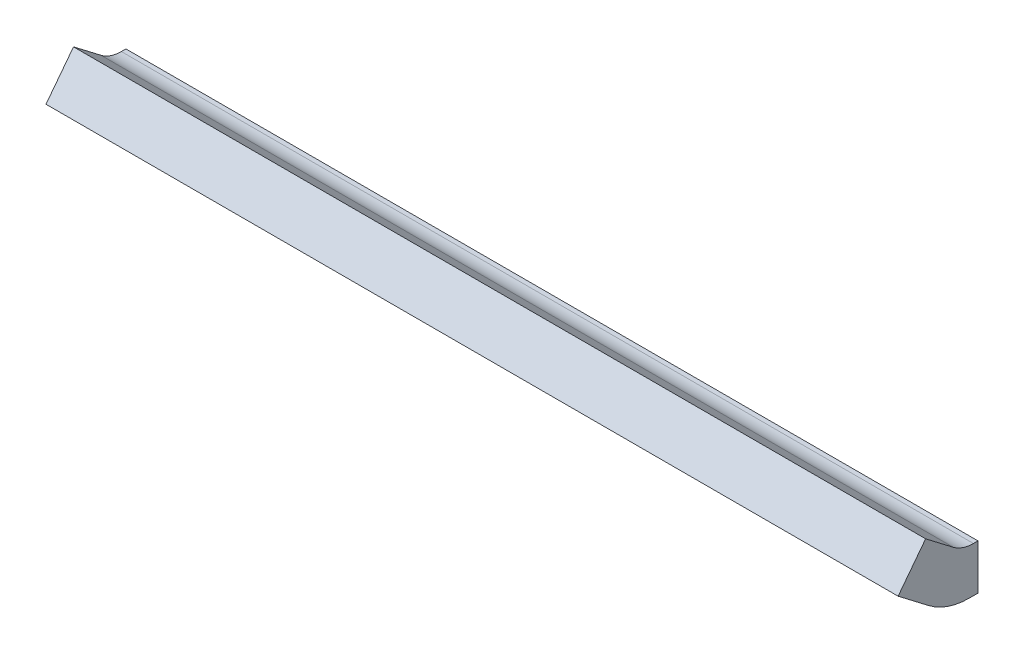
ISO-10303-21;
HEADER;
FILE_DESCRIPTION(('STEP AP214'),'2;1');
FILE_NAME('part.step','',(''),(''),'','','');
FILE_SCHEMA(('AUTOMOTIVE_DESIGN { 1 0 10303 214 1 1 1 1 }'));
ENDSEC;
DATA;
#1=APPLICATION_CONTEXT('core data for automotive mechanical design processes');
#2=APPLICATION_PROTOCOL_DEFINITION('international standard','automotive_design',2000,#1);
#3=PRODUCT_CONTEXT('',#1,'mechanical');
#4=PRODUCT('Part','Part','',(#3));
#5=PRODUCT_RELATED_PRODUCT_CATEGORY('part','',(#4));
#6=PRODUCT_DEFINITION_FORMATION('','',#4);
#7=PRODUCT_DEFINITION_CONTEXT('part definition',#1,'design');
#8=PRODUCT_DEFINITION('design','',#6,#7);
#9=PRODUCT_DEFINITION_SHAPE('','',#8);
#10=(LENGTH_UNIT() NAMED_UNIT(*) SI_UNIT(.MILLI.,.METRE.));
#11=(NAMED_UNIT(*) PLANE_ANGLE_UNIT() SI_UNIT($,.RADIAN.));
#12=(NAMED_UNIT(*) SI_UNIT($,.STERADIAN.) SOLID_ANGLE_UNIT());
#13=UNCERTAINTY_MEASURE_WITH_UNIT(LENGTH_MEASURE(1.E-05),#10,'distance_accuracy_value','');
#14=(GEOMETRIC_REPRESENTATION_CONTEXT(3) GLOBAL_UNCERTAINTY_ASSIGNED_CONTEXT((#13)) GLOBAL_UNIT_ASSIGNED_CONTEXT((#10,
#11,#12)) REPRESENTATION_CONTEXT('',''));
#15=CARTESIAN_POINT('',(0.,0.,0.));
#16=DIRECTION('',(0.,0.,1.));
#17=DIRECTION('',(1.,0.,0.));
#18=AXIS2_PLACEMENT_3D('',#15,#16,#17);
#19=CARTESIAN_POINT('',(3.2,1.26,2.5));
#20=DIRECTION('',(0.,0.,1.));
#21=DIRECTION('',(1.,0.,0.));
#22=AXIS2_PLACEMENT_3D('',#19,#20,#21);
#23=PLANE('',#22);
#24=DIRECTION('',(1.,0.,0.));
#25=VECTOR('',#24,1.);
#26=CARTESIAN_POINT('',(3.2,1.26,2.5));
#27=LINE('',#26,#25);
#28=CARTESIAN_POINT('',(-3.2,1.26,2.5));
#29=VERTEX_POINT('',#28);
#30=CARTESIAN_POINT('',(3.2,1.26,2.5));
#31=VERTEX_POINT('',#30);
#32=EDGE_CURVE('E88',#29,#31,#27,.T.);
#33=ORIENTED_EDGE('',*,*,#32,.T.);
#34=DIRECTION('',(0.,1.,0.));
#35=VECTOR('',#34,1.);
#36=CARTESIAN_POINT('',(3.2,1.26,2.5));
#37=LINE('',#36,#35);
#38=CARTESIAN_POINT('',(3.2,0.92,2.5));
#39=VERTEX_POINT('',#38);
#40=EDGE_CURVE('E82',#39,#31,#37,.T.);
#41=ORIENTED_EDGE('',*,*,#40,.F.);
#42=DIRECTION('',(1.,0.,0.));
#43=VECTOR('',#42,1.);
#44=CARTESIAN_POINT('',(3.2,0.92,2.5));
#45=LINE('',#44,#43);
#46=CARTESIAN_POINT('',(-3.2,0.92,2.5));
#47=VERTEX_POINT('',#46);
#48=EDGE_CURVE('E104',#39,#47,#45,.F.);
#49=ORIENTED_EDGE('',*,*,#48,.T.);
#50=DIRECTION('',(0.,1.,0.));
#51=VECTOR('',#50,1.);
#52=CARTESIAN_POINT('',(-3.2,1.26,2.5));
#53=LINE('',#52,#51);
#54=EDGE_CURVE('E119',#29,#47,#53,.F.);
#55=ORIENTED_EDGE('',*,*,#54,.F.);
#56=EDGE_LOOP('',(#33,#41,#49,#55));
#57=FACE_BOUND('',#56,.T.);
#58=ADVANCED_FACE('F17',(#57),#23,.F.);
#59=CARTESIAN_POINT('',(3.2,1.26,2.53428124927838));
#60=DIRECTION('',(0.,-1.,0.));
#61=DIRECTION('',(0.,0.,-1.));
#62=AXIS2_PLACEMENT_3D('',#59,#60,#61);
#63=PLANE('',#62);
#64=DIRECTION('',(-1.,0.,0.));
#65=VECTOR('',#64,1.);
#66=CARTESIAN_POINT('',(3.2,1.26,2.53428124927838));
#67=LINE('',#66,#65);
#68=CARTESIAN_POINT('',(-3.2,1.26,2.53428124927838));
#69=VERTEX_POINT('',#68);
#70=CARTESIAN_POINT('',(3.2,1.26,2.53428124927838));
#71=VERTEX_POINT('',#70);
#72=EDGE_CURVE('E93',#69,#71,#67,.F.);
#73=ORIENTED_EDGE('',*,*,#72,.T.);
#74=DIRECTION('',(0.,0.,-1.));
#75=VECTOR('',#74,1.);
#76=CARTESIAN_POINT('',(3.2,1.26,2.53428124927838));
#77=LINE('',#76,#75);
#78=EDGE_CURVE('E77',#31,#71,#77,.F.);
#79=ORIENTED_EDGE('',*,*,#78,.F.);
#80=ORIENTED_EDGE('',*,*,#32,.F.);
#81=DIRECTION('',(0.,0.,-1.));
#82=VECTOR('',#81,1.);
#83=CARTESIAN_POINT('',(-3.2,1.26,2.53428124927838));
#84=LINE('',#83,#82);
#85=EDGE_CURVE('E87',#69,#29,#84,.T.);
#86=ORIENTED_EDGE('',*,*,#85,.F.);
#87=EDGE_LOOP('',(#73,#79,#80,#86));
#88=FACE_BOUND('',#87,.T.);
#89=ADVANCED_FACE('F99',(#88),#63,.F.);
#90=CARTESIAN_POINT('',(3.2,0.92,2.5));
#91=DIRECTION('',(0.,1.,0.));
#92=DIRECTION('',(0.,0.,1.));
#93=AXIS2_PLACEMENT_3D('',#90,#91,#92);
#94=PLANE('',#93);
#95=ORIENTED_EDGE('',*,*,#48,.F.);
#96=DIRECTION('',(0.,0.,1.));
#97=VECTOR('',#96,1.);
#98=CARTESIAN_POINT('',(3.2,0.92,2.5));
#99=LINE('',#98,#97);
#100=CARTESIAN_POINT('',(3.2,0.92,2.56476908614361));
#101=VERTEX_POINT('',#100);
#102=EDGE_CURVE('E110',#101,#39,#99,.F.);
#103=ORIENTED_EDGE('',*,*,#102,.F.);
#104=DIRECTION('',(-1.,0.,0.));
#105=VECTOR('',#104,1.);
#106=CARTESIAN_POINT('',(3.2,0.92,2.56476908614361));
#107=LINE('',#106,#105);
#108=CARTESIAN_POINT('',(-3.2,0.92,2.56476908614361));
#109=VERTEX_POINT('',#108);
#110=EDGE_CURVE('E133',#109,#101,#107,.F.);
#111=ORIENTED_EDGE('',*,*,#110,.F.);
#112=DIRECTION('',(0.,0.,1.));
#113=VECTOR('',#112,1.);
#114=CARTESIAN_POINT('',(-3.2,0.92,2.5));
#115=LINE('',#114,#113);
#116=EDGE_CURVE('E101',#47,#109,#115,.T.);
#117=ORIENTED_EDGE('',*,*,#116,.F.);
#118=EDGE_LOOP('',(#95,#103,#111,#117));
#119=FACE_BOUND('',#118,.T.);
#120=ADVANCED_FACE('F177',(#119),#94,.F.);
#121=CARTESIAN_POINT('',(3.2,1.51,2.53428124927838));
#122=DIRECTION('',(-1.,0.,0.));
#123=DIRECTION('',(0.,0.,1.));
#124=AXIS2_PLACEMENT_3D('',#121,#122,#123);
#125=CYLINDRICAL_SURFACE('',#124,0.25);
#126=DIRECTION('',(1.,0.,0.));
#127=VECTOR('',#126,1.);
#128=CARTESIAN_POINT('',(3.2,1.3114705882353,2.68622226633553));
#129=LINE('',#128,#127);
#130=CARTESIAN_POINT('',(-3.2,1.3114705882353,2.68622226633553));
#131=VERTEX_POINT('',#130);
#132=CARTESIAN_POINT('',(3.2,1.3114705882353,2.68622226633553));
#133=VERTEX_POINT('',#132);
#134=EDGE_CURVE('E96',#131,#133,#129,.T.);
#135=ORIENTED_EDGE('',*,*,#134,.T.);
#136=CARTESIAN_POINT('',(3.2,1.51,2.53428124927838));
#137=DIRECTION('',(-1.,0.,0.));
#138=DIRECTION('',(0.,0.,1.));
#139=AXIS2_PLACEMENT_3D('',#136,#137,#138);
#140=CIRCLE('',#139,0.25);
#141=EDGE_CURVE('E20',#71,#133,#140,.T.);
#142=ORIENTED_EDGE('',*,*,#141,.F.);
#143=ORIENTED_EDGE('',*,*,#72,.F.);
#144=CARTESIAN_POINT('',(-3.2,1.51,2.53428124927838));
#145=DIRECTION('',(-1.,0.,0.));
#146=DIRECTION('',(0.,0.,1.));
#147=AXIS2_PLACEMENT_3D('',#144,#145,#146);
#148=CIRCLE('',#147,0.25);
#149=EDGE_CURVE('E98',#131,#69,#148,.F.);
#150=ORIENTED_EDGE('',*,*,#149,.F.);
#151=EDGE_LOOP('',(#135,#142,#143,#150));
#152=FACE_BOUND('',#151,.T.);
#153=ADVANCED_FACE('F92',(#152),#125,.F.);
#154=CARTESIAN_POINT('',(3.2,1.42,2.56476908614361));
#155=DIRECTION('',(-1.,0.,0.));
#156=DIRECTION('',(0.,0.,1.));
#157=AXIS2_PLACEMENT_3D('',#154,#155,#156);
#158=CYLINDRICAL_SURFACE('',#157,0.5);
#159=CARTESIAN_POINT('',(3.2,1.42,2.56476908614361));
#160=DIRECTION('',(-1.,0.,0.));
#161=DIRECTION('',(0.,0.,1.));
#162=AXIS2_PLACEMENT_3D('',#159,#160,#161);
#163=CIRCLE('',#162,0.5);
#164=CARTESIAN_POINT('',(3.2,1.02294117647059,2.86865112025791));
#165=VERTEX_POINT('',#164);
#166=EDGE_CURVE('E129',#101,#165,#163,.T.);
#167=ORIENTED_EDGE('',*,*,#166,.T.);
#168=DIRECTION('',(1.,0.,0.));
#169=VECTOR('',#168,1.);
#170=CARTESIAN_POINT('',(3.2,1.02294117647059,2.86865112025791));
#171=LINE('',#170,#169);
#172=CARTESIAN_POINT('',(-3.2,1.02294117647059,2.86865112025791));
#173=VERTEX_POINT('',#172);
#174=EDGE_CURVE('E155',#165,#173,#171,.F.);
#175=ORIENTED_EDGE('',*,*,#174,.T.);
#176=CARTESIAN_POINT('',(-3.2,1.42,2.56476908614361));
#177=DIRECTION('',(-1.,0.,0.));
#178=DIRECTION('',(0.,0.,1.));
#179=AXIS2_PLACEMENT_3D('',#176,#177,#178);
#180=CIRCLE('',#179,0.5);
#181=EDGE_CURVE('E132',#173,#109,#180,.F.);
#182=ORIENTED_EDGE('',*,*,#181,.T.);
#183=ORIENTED_EDGE('',*,*,#110,.T.);
#184=EDGE_LOOP('',(#167,#175,#182,#183));
#185=FACE_BOUND('',#184,.T.);
#186=ADVANCED_FACE('F180',(#185),#158,.T.);
#187=CARTESIAN_POINT('',(3.2,1.47,2.89336021680228));
#188=DIRECTION('',(0.,-0.794117647058824,0.607764068228583));
#189=DIRECTION('',(0.,-0.607764068228583,-0.794117647058824));
#190=AXIS2_PLACEMENT_3D('',#187,#188,#189);
#191=PLANE('',#190);
#192=DIRECTION('',(1.,0.,0.));
#193=VECTOR('',#192,1.);
#194=CARTESIAN_POINT('',(3.2,1.47,2.89336021680228));
#195=LINE('',#194,#193);
#196=CARTESIAN_POINT('',(-3.2,1.47,2.89336021680228));
#197=VERTEX_POINT('',#196);
#198=CARTESIAN_POINT('',(3.2,1.47,2.89336021680228));
#199=VERTEX_POINT('',#198);
#200=EDGE_CURVE('E148',#197,#199,#195,.T.);
#201=ORIENTED_EDGE('',*,*,#200,.T.);
#202=DIRECTION('',(0.,-0.607764068228607,-0.794117647058805));
#203=VECTOR('',#202,1.);
#204=CARTESIAN_POINT('',(3.2,1.47,2.89336021680228));
#205=LINE('',#204,#203);
#206=EDGE_CURVE('E131',#199,#133,#205,.T.);
#207=ORIENTED_EDGE('',*,*,#206,.T.);
#208=ORIENTED_EDGE('',*,*,#134,.F.);
#209=DIRECTION('',(0.,-0.607764068228607,-0.794117647058805));
#210=VECTOR('',#209,1.);
#211=CARTESIAN_POINT('',(-3.2,1.47,2.89336021680228));
#212=LINE('',#211,#210);
#213=EDGE_CURVE('E137',#197,#131,#212,.T.);
#214=ORIENTED_EDGE('',*,*,#213,.F.);
#215=EDGE_LOOP('',(#201,#207,#208,#214));
#216=FACE_BOUND('',#215,.T.);
#217=ADVANCED_FACE('F140',(#216),#191,.F.);
#218=CARTESIAN_POINT('',(3.2,1.42,2.56476908614361));
#219=DIRECTION('',(-1.,0.,0.));
#220=DIRECTION('',(0.,0.,1.));
#221=AXIS2_PLACEMENT_3D('',#218,#219,#220);
#222=PLANE('',#221);
#223=ORIENTED_EDGE('',*,*,#78,.T.);
#224=ORIENTED_EDGE('',*,*,#141,.T.);
#225=ORIENTED_EDGE('',*,*,#206,.F.);
#226=DIRECTION('',(0.,0.794117647058824,-0.607764068228583));
#227=VECTOR('',#226,1.);
#228=CARTESIAN_POINT('',(3.2,1.2,3.1));
#229=LINE('',#228,#227);
#230=CARTESIAN_POINT('',(3.2,1.2,3.1));
#231=VERTEX_POINT('',#230);
#232=EDGE_CURVE('E150',#199,#231,#229,.F.);
#233=ORIENTED_EDGE('',*,*,#232,.T.);
#234=DIRECTION('',(0.,0.607764068228582,0.794117647058824));
#235=VECTOR('',#234,1.);
#236=CARTESIAN_POINT('',(3.2,1.02294117647059,2.86865112025791));
#237=LINE('',#236,#235);
#238=EDGE_CURVE('E158',#231,#165,#237,.F.);
#239=ORIENTED_EDGE('',*,*,#238,.T.);
#240=ORIENTED_EDGE('',*,*,#166,.F.);
#241=ORIENTED_EDGE('',*,*,#102,.T.);
#242=ORIENTED_EDGE('',*,*,#40,.T.);
#243=EDGE_LOOP('',(#223,#224,#225,#233,#239,#240,#241,#242));
#244=FACE_BOUND('',#243,.T.);
#245=ADVANCED_FACE('F79',(#244),#222,.F.);
#246=CARTESIAN_POINT('',(3.2,1.02294117647059,2.86865112025791));
#247=DIRECTION('',(0.,0.794117647058824,-0.607764068228582));
#248=DIRECTION('',(0.,0.607764068228582,0.794117647058824));
#249=AXIS2_PLACEMENT_3D('',#246,#247,#248);
#250=PLANE('',#249);
#251=ORIENTED_EDGE('',*,*,#174,.F.);
#252=ORIENTED_EDGE('',*,*,#238,.F.);
#253=DIRECTION('',(1.,0.,0.));
#254=VECTOR('',#253,1.);
#255=CARTESIAN_POINT('',(3.2,1.2,3.1));
#256=LINE('',#255,#254);
#257=CARTESIAN_POINT('',(-3.2,1.2,3.1));
#258=VERTEX_POINT('',#257);
#259=EDGE_CURVE('E26',#231,#258,#256,.F.);
#260=ORIENTED_EDGE('',*,*,#259,.T.);
#261=DIRECTION('',(0.,0.607764068228585,0.794117647058822));
#262=VECTOR('',#261,1.);
#263=CARTESIAN_POINT('',(-3.2,1.02294117647059,2.86865112025791));
#264=LINE('',#263,#262);
#265=EDGE_CURVE('E34',#173,#258,#264,.T.);
#266=ORIENTED_EDGE('',*,*,#265,.F.);
#267=EDGE_LOOP('',(#251,#252,#260,#266));
#268=FACE_BOUND('',#267,.T.);
#269=ADVANCED_FACE('F195',(#268),#250,.F.);
#270=CARTESIAN_POINT('',(-3.2,1.42,2.56476908614361));
#271=DIRECTION('',(-1.,0.,0.));
#272=DIRECTION('',(0.,0.,1.));
#273=AXIS2_PLACEMENT_3D('',#270,#271,#272);
#274=PLANE('',#273);
#275=ORIENTED_EDGE('',*,*,#149,.T.);
#276=ORIENTED_EDGE('',*,*,#85,.T.);
#277=ORIENTED_EDGE('',*,*,#54,.T.);
#278=ORIENTED_EDGE('',*,*,#116,.T.);
#279=ORIENTED_EDGE('',*,*,#181,.F.);
#280=ORIENTED_EDGE('',*,*,#265,.T.);
#281=DIRECTION('',(0.,0.794117647058824,-0.607764068228583));
#282=VECTOR('',#281,1.);
#283=CARTESIAN_POINT('',(-3.2,1.2,3.1));
#284=LINE('',#283,#282);
#285=EDGE_CURVE('E11',#258,#197,#284,.T.);
#286=ORIENTED_EDGE('',*,*,#285,.T.);
#287=ORIENTED_EDGE('',*,*,#213,.T.);
#288=EDGE_LOOP('',(#275,#276,#277,#278,#279,#280,#286,#287));
#289=FACE_BOUND('',#288,.T.);
#290=ADVANCED_FACE('F135',(#289),#274,.T.);
#291=CARTESIAN_POINT('',(3.2,1.2,3.1));
#292=DIRECTION('',(0.,-0.607764068228583,-0.794117647058824));
#293=DIRECTION('',(0.,0.794117647058824,-0.607764068228583));
#294=AXIS2_PLACEMENT_3D('',#291,#292,#293);
#295=PLANE('',#294);
#296=ORIENTED_EDGE('',*,*,#259,.F.);
#297=ORIENTED_EDGE('',*,*,#232,.F.);
#298=ORIENTED_EDGE('',*,*,#200,.F.);
#299=ORIENTED_EDGE('',*,*,#285,.F.);
#300=EDGE_LOOP('',(#296,#297,#298,#299));
#301=FACE_BOUND('',#300,.T.);
#302=ADVANCED_FACE('F188',(#301),#295,.F.);
#303=CLOSED_SHELL('',(#58,#89,#120,#153,#186,#217,#245,#269,#290,#302));
#304=MANIFOLD_SOLID_BREP('B1',#303);
#305=ADVANCED_BREP_SHAPE_REPRESENTATION('',(#18,#304),#14);
#306=SHAPE_DEFINITION_REPRESENTATION(#9,#305);
ENDSEC;
END-ISO-10303-21;
